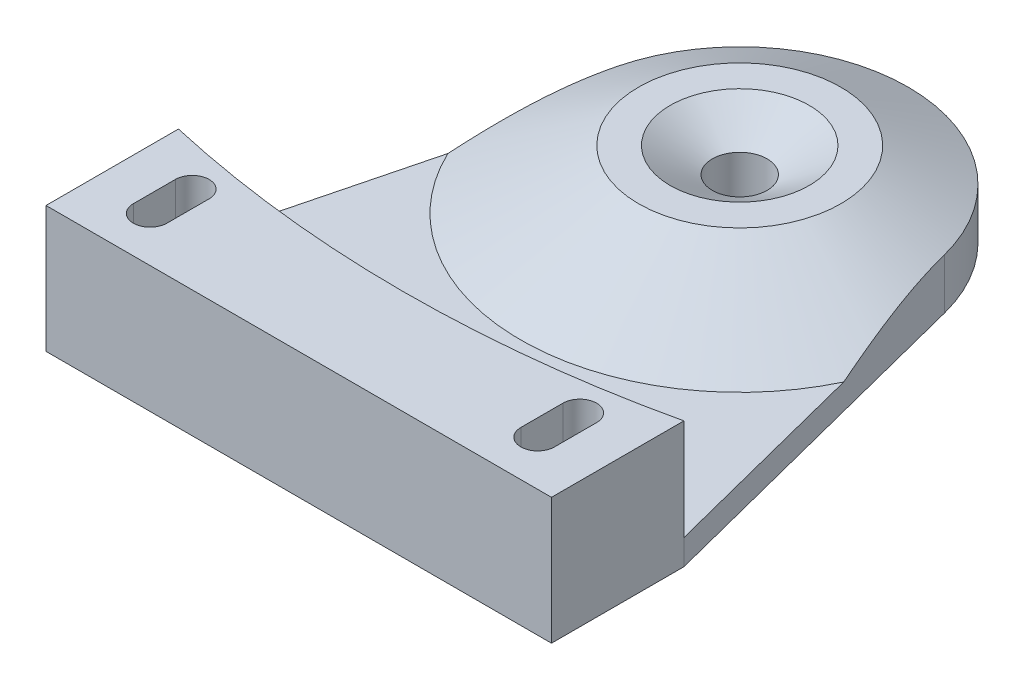
ISO-10303-21;
HEADER;
FILE_DESCRIPTION(('STEP AP214'),'2;1');
FILE_NAME('part.step','',(''),(''),'','','');
FILE_SCHEMA(('AUTOMOTIVE_DESIGN { 1 0 10303 214 1 1 1 1 }'));
ENDSEC;
DATA;
#1=APPLICATION_CONTEXT('core data for automotive mechanical design processes');
#2=APPLICATION_PROTOCOL_DEFINITION('international standard','automotive_design',2000,#1);
#3=PRODUCT_CONTEXT('',#1,'mechanical');
#4=PRODUCT('Part','Part','',(#3));
#5=PRODUCT_RELATED_PRODUCT_CATEGORY('part','',(#4));
#6=PRODUCT_DEFINITION_FORMATION('','',#4);
#7=PRODUCT_DEFINITION_CONTEXT('part definition',#1,'design');
#8=PRODUCT_DEFINITION('design','',#6,#7);
#9=PRODUCT_DEFINITION_SHAPE('','',#8);
#10=(LENGTH_UNIT() NAMED_UNIT(*) SI_UNIT(.MILLI.,.METRE.));
#11=(NAMED_UNIT(*) PLANE_ANGLE_UNIT() SI_UNIT($,.RADIAN.));
#12=(NAMED_UNIT(*) SI_UNIT($,.STERADIAN.) SOLID_ANGLE_UNIT());
#13=UNCERTAINTY_MEASURE_WITH_UNIT(LENGTH_MEASURE(1.E-05),#10,'distance_accuracy_value','');
#14=(GEOMETRIC_REPRESENTATION_CONTEXT(3) GLOBAL_UNCERTAINTY_ASSIGNED_CONTEXT((#13)) GLOBAL_UNIT_ASSIGNED_CONTEXT((#10,
#11,#12)) REPRESENTATION_CONTEXT('',''));
#15=CARTESIAN_POINT('',(0.,0.,0.));
#16=DIRECTION('',(0.,0.,1.));
#17=DIRECTION('',(1.,0.,0.));
#18=AXIS2_PLACEMENT_3D('',#15,#16,#17);
#19=CARTESIAN_POINT('',(30.,10.,372.350901436273));
#20=DIRECTION('',(-0.968875886471103,0.,0.247546998799894));
#21=DIRECTION('',(0.247546998799894,0.,0.968875886471103));
#22=AXIS2_PLACEMENT_3D('',#19,#20,#21);
#23=PLANE('',#22);
#24=DIRECTION('',(0.,-1.,0.));
#25=VECTOR('',#24,1.);
#26=CARTESIAN_POINT('',(19.3775177294221,10.,330.775495649393));
#27=LINE('',#26,#25);
#28=CARTESIAN_POINT('',(19.3775177294221,6.00000000000001,330.775495649393));
#29=VERTEX_POINT('',#28);
#30=CARTESIAN_POINT('',(19.3775177294221,0.,330.775495649393));
#31=VERTEX_POINT('',#30);
#32=EDGE_CURVE('E52',#29,#31,#27,.T.);
#33=ORIENTED_EDGE('',*,*,#32,.F.);
#34=CARTESIAN_POINT('',(19.3775177294221,6.00000000000001,330.775495649393));
#35=CARTESIAN_POINT('',(19.4653576637055,6.00001837678319,331.119292967111));
#36=CARTESIAN_POINT('',(19.5531965877423,5.99527873658229,331.463086330817));
#37=CARTESIAN_POINT('',(19.7288088840434,5.97641846988816,332.1504164947));
#38=CARTESIAN_POINT('',(19.8165822590787,5.96229826541334,332.493953305723));
#39=CARTESIAN_POINT('',(19.9919594290488,5.92482224007808,333.180363207056));
#40=CARTESIAN_POINT('',(20.0795632908415,5.90147152088045,333.523236559043));
#41=CARTESIAN_POINT('',(20.2545947180135,5.84579604390783,334.208293255281));
#42=CARTESIAN_POINT('',(20.3420222818002,5.81347120542544,334.5504765933));
#43=CARTESIAN_POINT('',(20.6029228107527,5.70395231440813,335.571616952485));
#44=CARTESIAN_POINT('',(20.7760749274221,5.6139793813379,336.249318202533));
#45=CARTESIAN_POINT('',(21.1212210492543,5.40312717585829,337.600187962107));
#46=CARTESIAN_POINT('',(21.2932149179657,5.28224432518143,338.273355937576));
#47=CARTESIAN_POINT('',(21.6354415536571,5.01374288579408,339.612799100438));
#48=CARTESIAN_POINT('',(21.8056777536492,4.86619516051103,340.279087724321));
#49=CARTESIAN_POINT('',(22.1448183664011,4.54793154069247,341.606452480958));
#50=CARTESIAN_POINT('',(22.3137226896494,4.37721410279847,342.267528263373));
#51=CARTESIAN_POINT('',(22.6512796681293,4.01501192800049,343.588694823035));
#52=CARTESIAN_POINT('',(22.819924228761,3.82340466618228,344.248753918774));
#53=CARTESIAN_POINT('',(23.0719388315378,3.52347904450955,345.235115590912));
#54=CARTESIAN_POINT('',(23.1557713234223,3.42143580825921,345.5632281525));
#55=CARTESIAN_POINT('',(23.3231410579882,3.213511984126,346.218297697807));
#56=CARTESIAN_POINT('',(23.4066783111607,3.10763153413315,346.545254722587));
#57=CARTESIAN_POINT('',(23.490077344272,3.00000000000001,346.871670766927));
#58=B_SPLINE_CURVE_WITH_KNOTS('',3,(#34,#35,#36,#37,#38,#39,#40,#41,#42,#43,#44,#45,#46,#47,#48,
#49,#50,#51,#52,#53,#54,#55,#56,#57),.UNSPECIFIED.,.F.,.F.,(4,2,2,2,2,2,2,2,2,2,2,4),(0.,
1.06448581509192,2.12892374370533,3.19277418311373,4.25663419041057,6.37148743220264,
8.4865856095986,10.5961433112673,12.7058416017824,14.8286573611,15.8897172994038,
16.9507391463226),.UNSPECIFIED.);
#59=CARTESIAN_POINT('',(23.490077344272,3.,346.871670766927));
#60=VERTEX_POINT('',#59);
#61=EDGE_CURVE('E297',#29,#60,#58,.T.);
#62=ORIENTED_EDGE('',*,*,#61,.T.);
#63=DIRECTION('',(0.247546998799894,0.,0.968875886471103));
#64=VECTOR('',#63,1.);
#65=CARTESIAN_POINT('',(30.,3.,372.350901436273));
#66=LINE('',#65,#64);
#67=CARTESIAN_POINT('',(30.,3.,372.350901436273));
#68=VERTEX_POINT('',#67);
#69=EDGE_CURVE('E173',#60,#68,#66,.T.);
#70=ORIENTED_EDGE('',*,*,#69,.T.);
#71=DIRECTION('',(0.,-1.,0.));
#72=VECTOR('',#71,1.);
#73=CARTESIAN_POINT('',(30.,10.,372.350901436273));
#74=LINE('',#73,#72);
#75=CARTESIAN_POINT('',(30.,0.,372.350901436273));
#76=VERTEX_POINT('',#75);
#77=EDGE_CURVE('E193',#68,#76,#74,.T.);
#78=ORIENTED_EDGE('',*,*,#77,.T.);
#79=DIRECTION('',(-0.247546998799894,0.,-0.968875886471103));
#80=VECTOR('',#79,1.);
#81=CARTESIAN_POINT('',(30.,0.,372.350901436273));
#82=LINE('',#81,#80);
#83=EDGE_CURVE('E514',#76,#31,#82,.T.);
#84=ORIENTED_EDGE('',*,*,#83,.T.);
#85=EDGE_LOOP('',(#33,#62,#70,#78,#84));
#86=FACE_BOUND('',#85,.T.);
#87=ADVANCED_FACE('F37',(#86),#23,.F.);
#88=CARTESIAN_POINT('',(0.,10.,335.726435625391));
#89=DIRECTION('',(0.,-1.,0.));
#90=DIRECTION('',(0.,0.,-1.));
#91=AXIS2_PLACEMENT_3D('',#88,#89,#90);
#92=CYLINDRICAL_SURFACE('',#91,20.);
#93=DIRECTION('',(0.,-1.,0.));
#94=VECTOR('',#93,1.);
#95=CARTESIAN_POINT('',(-19.3775177294221,10.,330.775495649393));
#96=LINE('',#95,#94);
#97=CARTESIAN_POINT('',(-19.3775177294221,6.00000000000001,330.775495649393));
#98=VERTEX_POINT('',#97);
#99=CARTESIAN_POINT('',(-19.3775177294221,0.,330.775495649393));
#100=VERTEX_POINT('',#99);
#101=EDGE_CURVE('E59',#98,#100,#96,.T.);
#102=ORIENTED_EDGE('',*,*,#101,.F.);
#103=CARTESIAN_POINT('',(0.,6.00000000000001,335.726435625391));
#104=DIRECTION('',(0.,-1.,0.));
#105=DIRECTION('',(0.,0.,-1.));
#106=AXIS2_PLACEMENT_3D('',#103,#104,#105);
#107=CIRCLE('',#106,20.);
#108=EDGE_CURVE('E284',#98,#29,#107,.T.);
#109=ORIENTED_EDGE('',*,*,#108,.T.);
#110=ORIENTED_EDGE('',*,*,#32,.T.);
#111=CARTESIAN_POINT('',(0.,0.,335.726435625391));
#112=DIRECTION('',(0.,1.,0.));
#113=DIRECTION('',(0.,0.,1.));
#114=AXIS2_PLACEMENT_3D('',#111,#112,#113);
#115=CIRCLE('',#114,20.);
#116=EDGE_CURVE('E188',#31,#100,#115,.T.);
#117=ORIENTED_EDGE('',*,*,#116,.T.);
#118=EDGE_LOOP('',(#102,#109,#110,#117));
#119=FACE_BOUND('',#118,.T.);
#120=ADVANCED_FACE('F307',(#119),#92,.T.);
#121=CARTESIAN_POINT('',(-30.,10.,372.350901436273));
#122=DIRECTION('',(0.968875886471103,0.,0.247546998799892));
#123=DIRECTION('',(0.247546998799892,0.,-0.968875886471103));
#124=AXIS2_PLACEMENT_3D('',#121,#122,#123);
#125=PLANE('',#124);
#126=DIRECTION('',(0.247546998799892,0.,-0.968875886471103));
#127=VECTOR('',#126,1.);
#128=CARTESIAN_POINT('',(-30.,3.,372.350901436273));
#129=LINE('',#128,#127);
#130=CARTESIAN_POINT('',(-30.,3.,372.350901436273));
#131=VERTEX_POINT('',#130);
#132=CARTESIAN_POINT('',(-23.4900773442719,3.,346.871670766927));
#133=VERTEX_POINT('',#132);
#134=EDGE_CURVE('E174',#131,#133,#129,.T.);
#135=ORIENTED_EDGE('',*,*,#134,.T.);
#136=CARTESIAN_POINT('',(-23.4900773442719,3.,346.871670766927));
#137=CARTESIAN_POINT('',(-23.4066783111607,3.10763153413313,346.545254722587));
#138=CARTESIAN_POINT('',(-23.3231410579882,3.21351198412598,346.218297697807));
#139=CARTESIAN_POINT('',(-23.1557713234223,3.42143580825919,345.5632281525));
#140=CARTESIAN_POINT('',(-23.0719388315378,3.52347904450953,345.235115590912));
#141=CARTESIAN_POINT('',(-22.819924228761,3.82340466618226,344.248753918774));
#142=CARTESIAN_POINT('',(-22.6512796681293,4.01501192800047,343.588694823036));
#143=CARTESIAN_POINT('',(-22.3137226896494,4.37721410279845,342.267528263373));
#144=CARTESIAN_POINT('',(-22.1448183664011,4.54793154069245,341.606452480958));
#145=CARTESIAN_POINT('',(-21.8056777536492,4.86619516051102,340.279087724321));
#146=CARTESIAN_POINT('',(-21.6354415536571,5.01374288579407,339.612799100438));
#147=CARTESIAN_POINT('',(-21.2932149179657,5.28224432518143,338.273355937576));
#148=CARTESIAN_POINT('',(-21.1212210492543,5.40312717585828,337.600187962107));
#149=CARTESIAN_POINT('',(-20.7760749274221,5.6139793813379,336.249318202533));
#150=CARTESIAN_POINT('',(-20.6029228107527,5.70395231440813,335.571616952485));
#151=CARTESIAN_POINT('',(-20.3420222818002,5.81347120542544,334.5504765933));
#152=CARTESIAN_POINT('',(-20.2545947180135,5.84579604390783,334.208293255281));
#153=CARTESIAN_POINT('',(-20.0795632908415,5.90147152088045,333.523236559043));
#154=CARTESIAN_POINT('',(-19.9919594290488,5.92482224007808,333.180363207056));
#155=CARTESIAN_POINT('',(-19.8165822590787,5.96229826541334,332.493953305723));
#156=CARTESIAN_POINT('',(-19.7288088840434,5.97641846988816,332.1504164947));
#157=CARTESIAN_POINT('',(-19.5531965877423,5.99527873658229,331.463086330817));
#158=CARTESIAN_POINT('',(-19.4653576637055,6.00001837678319,331.119292967111));
#159=CARTESIAN_POINT('',(-19.3775177294221,6.00000000000001,330.775495649393));
#160=B_SPLINE_CURVE_WITH_KNOTS('',3,(#136,#137,#138,#139,#140,#141,#142,#143,#144,#145,#146,
#147,#148,#149,#150,#151,#152,#153,#154,#155,#156,#157,#158,#159),.UNSPECIFIED.,.F.,.F.,(4,2,2,
2,2,2,2,2,2,2,2,4),(0.,1.06102184691878,2.12208178522253,4.24489754454015,6.35459583505528,
8.46415353672401,10.57925171412,12.694104955912,13.7579649632089,14.8218154026173,
15.8862533312307,16.9507391463227),.UNSPECIFIED.);
#161=EDGE_CURVE('E278',#133,#98,#160,.T.);
#162=ORIENTED_EDGE('',*,*,#161,.T.);
#163=ORIENTED_EDGE('',*,*,#101,.T.);
#164=DIRECTION('',(-0.247546998799892,0.,0.968875886471103));
#165=VECTOR('',#164,1.);
#166=CARTESIAN_POINT('',(-30.,0.,372.350901436273));
#167=LINE('',#166,#165);
#168=CARTESIAN_POINT('',(-30.,0.,372.350901436273));
#169=VERTEX_POINT('',#168);
#170=EDGE_CURVE('E185',#100,#169,#167,.T.);
#171=ORIENTED_EDGE('',*,*,#170,.T.);
#172=DIRECTION('',(0.,-1.,0.));
#173=VECTOR('',#172,1.);
#174=CARTESIAN_POINT('',(-30.,10.,372.350901436273));
#175=LINE('',#174,#173);
#176=EDGE_CURVE('E153',#131,#169,#175,.T.);
#177=ORIENTED_EDGE('',*,*,#176,.F.);
#178=EDGE_LOOP('',(#135,#162,#163,#171,#177));
#179=FACE_BOUND('',#178,.T.);
#180=ADVANCED_FACE('F183',(#179),#125,.F.);
#181=CARTESIAN_POINT('',(0.,15.,240.726435625391));
#182=DIRECTION('',(0.,1.,0.));
#183=DIRECTION('',(0.,0.,1.));
#184=AXIS2_PLACEMENT_3D('',#181,#182,#183);
#185=PLANE('',#184);
#186=DIRECTION('',(0.,0.,-1.));
#187=VECTOR('',#186,1.);
#188=CARTESIAN_POINT('',(-21.,15.,382.710658493947));
#189=LINE('',#188,#187);
#190=CARTESIAN_POINT('',(-21.,15.,382.710658493947));
#191=VERTEX_POINT('',#190);
#192=CARTESIAN_POINT('',(-21.,15.,377.710658493947));
#193=VERTEX_POINT('',#192);
#194=EDGE_CURVE('E229',#191,#193,#189,.T.);
#195=ORIENTED_EDGE('',*,*,#194,.F.);
#196=CARTESIAN_POINT('',(-23.,15.,382.710658493947));
#197=DIRECTION('',(0.,1.,0.));
#198=DIRECTION('',(0.,0.,1.));
#199=AXIS2_PLACEMENT_3D('',#196,#197,#198);
#200=CIRCLE('',#199,2.);
#201=CARTESIAN_POINT('',(-25.,15.,382.710658493947));
#202=VERTEX_POINT('',#201);
#203=EDGE_CURVE('E227',#202,#191,#200,.T.);
#204=ORIENTED_EDGE('',*,*,#203,.F.);
#205=DIRECTION('',(0.,0.,1.));
#206=VECTOR('',#205,1.);
#207=CARTESIAN_POINT('',(-25.,15.,377.710658493947));
#208=LINE('',#207,#206);
#209=CARTESIAN_POINT('',(-25.,15.,377.710658493947));
#210=VERTEX_POINT('',#209);
#211=EDGE_CURVE('E235',#210,#202,#208,.T.);
#212=ORIENTED_EDGE('',*,*,#211,.F.);
#213=CARTESIAN_POINT('',(-23.,15.,377.710658493947));
#214=DIRECTION('',(0.,1.,0.));
#215=DIRECTION('',(0.,0.,1.));
#216=AXIS2_PLACEMENT_3D('',#213,#214,#215);
#217=CIRCLE('',#216,2.);
#218=EDGE_CURVE('E232',#193,#210,#217,.T.);
#219=ORIENTED_EDGE('',*,*,#218,.F.);
#220=EDGE_LOOP('',(#195,#204,#212,#219));
#221=FACE_BOUND('',#220,.T.);
#222=CARTESIAN_POINT('',(0.,15.,240.726435625391));
#223=DIRECTION('',(0.,-1.,0.));
#224=DIRECTION('',(0.,0.,1.));
#225=AXIS2_PLACEMENT_3D('',#222,#223,#224);
#226=CIRCLE('',#225,135.);
#227=CARTESIAN_POINT('',(30.,15.,372.350901436273));
#228=VERTEX_POINT('',#227);
#229=CARTESIAN_POINT('',(-30.,15.,372.350901436273));
#230=VERTEX_POINT('',#229);
#231=EDGE_CURVE('E258',#228,#230,#226,.T.);
#232=ORIENTED_EDGE('',*,*,#231,.T.);
#233=DIRECTION('',(0.,0.,1.));
#234=VECTOR('',#233,1.);
#235=CARTESIAN_POINT('',(-30.,15.,372.350901436273));
#236=LINE('',#235,#234);
#237=CARTESIAN_POINT('',(-30.,15.,388.07041555162));
#238=VERTEX_POINT('',#237);
#239=EDGE_CURVE('E156',#230,#238,#236,.T.);
#240=ORIENTED_EDGE('',*,*,#239,.T.);
#241=DIRECTION('',(1.,0.,0.));
#242=VECTOR('',#241,1.);
#243=CARTESIAN_POINT('',(-30.,15.,388.07041555162));
#244=LINE('',#243,#242);
#245=CARTESIAN_POINT('',(30.,15.,388.07041555162));
#246=VERTEX_POINT('',#245);
#247=EDGE_CURVE('E262',#238,#246,#244,.T.);
#248=ORIENTED_EDGE('',*,*,#247,.T.);
#249=DIRECTION('',(0.,0.,-1.));
#250=VECTOR('',#249,1.);
#251=CARTESIAN_POINT('',(30.,15.,372.350901436273));
#252=LINE('',#251,#250);
#253=EDGE_CURVE('E264',#246,#228,#252,.T.);
#254=ORIENTED_EDGE('',*,*,#253,.T.);
#255=EDGE_LOOP('',(#232,#240,#248,#254));
#256=FACE_BOUND('',#255,.T.);
#257=DIRECTION('',(0.,0.,-1.));
#258=VECTOR('',#257,1.);
#259=CARTESIAN_POINT('',(25.,15.,377.710658493947));
#260=LINE('',#259,#258);
#261=CARTESIAN_POINT('',(25.,15.,382.710658493947));
#262=VERTEX_POINT('',#261);
#263=CARTESIAN_POINT('',(25.,15.,377.710658493947));
#264=VERTEX_POINT('',#263);
#265=EDGE_CURVE('E198',#262,#264,#260,.T.);
#266=ORIENTED_EDGE('',*,*,#265,.F.);
#267=CARTESIAN_POINT('',(23.,15.,382.710658493947));
#268=DIRECTION('',(0.,1.,0.));
#269=DIRECTION('',(0.,0.,-1.));
#270=AXIS2_PLACEMENT_3D('',#267,#268,#269);
#271=CIRCLE('',#270,2.);
#272=CARTESIAN_POINT('',(21.,15.,382.710658493947));
#273=VERTEX_POINT('',#272);
#274=EDGE_CURVE('E196',#273,#262,#271,.T.);
#275=ORIENTED_EDGE('',*,*,#274,.F.);
#276=DIRECTION('',(0.,0.,1.));
#277=VECTOR('',#276,1.);
#278=CARTESIAN_POINT('',(21.,15.,382.710658493947));
#279=LINE('',#278,#277);
#280=CARTESIAN_POINT('',(21.,15.,377.710658493947));
#281=VERTEX_POINT('',#280);
#282=EDGE_CURVE('E204',#281,#273,#279,.T.);
#283=ORIENTED_EDGE('',*,*,#282,.F.);
#284=CARTESIAN_POINT('',(23.,15.,377.710658493947));
#285=DIRECTION('',(0.,1.,0.));
#286=DIRECTION('',(0.,0.,-1.));
#287=AXIS2_PLACEMENT_3D('',#284,#285,#286);
#288=CIRCLE('',#287,2.);
#289=EDGE_CURVE('E201',#264,#281,#288,.T.);
#290=ORIENTED_EDGE('',*,*,#289,.F.);
#291=EDGE_LOOP('',(#266,#275,#283,#290));
#292=FACE_BOUND('',#291,.T.);
#293=ADVANCED_FACE('F341',(#221,#256,#292),#185,.T.);
#294=CARTESIAN_POINT('',(0.,0.,240.726435625391));
#295=DIRECTION('',(0.,1.,0.));
#296=DIRECTION('',(0.,0.,1.));
#297=AXIS2_PLACEMENT_3D('',#294,#295,#296);
#298=PLANE('',#297);
#299=CARTESIAN_POINT('',(-23.,0.,382.710658493947));
#300=DIRECTION('',(0.,1.,0.));
#301=DIRECTION('',(0.,0.,1.));
#302=AXIS2_PLACEMENT_3D('',#299,#300,#301);
#303=CIRCLE('',#302,2.);
#304=CARTESIAN_POINT('',(-25.,0.,382.710658493946));
#305=VERTEX_POINT('',#304);
#306=CARTESIAN_POINT('',(-21.,0.,382.710658493947));
#307=VERTEX_POINT('',#306);
#308=EDGE_CURVE('E226',#305,#307,#303,.T.);
#309=ORIENTED_EDGE('',*,*,#308,.T.);
#310=DIRECTION('',(0.,0.,-1.));
#311=VECTOR('',#310,1.);
#312=CARTESIAN_POINT('',(-21.,0.,382.710658493947));
#313=LINE('',#312,#311);
#314=CARTESIAN_POINT('',(-21.,0.,377.710658493947));
#315=VERTEX_POINT('',#314);
#316=EDGE_CURVE('E240',#307,#315,#313,.T.);
#317=ORIENTED_EDGE('',*,*,#316,.T.);
#318=CARTESIAN_POINT('',(-23.,0.,377.710658493947));
#319=DIRECTION('',(0.,1.,0.));
#320=DIRECTION('',(0.,0.,1.));
#321=AXIS2_PLACEMENT_3D('',#318,#319,#320);
#322=CIRCLE('',#321,2.);
#323=CARTESIAN_POINT('',(-25.,0.,377.710658493947));
#324=VERTEX_POINT('',#323);
#325=EDGE_CURVE('E243',#315,#324,#322,.T.);
#326=ORIENTED_EDGE('',*,*,#325,.T.);
#327=DIRECTION('',(0.,0.,1.));
#328=VECTOR('',#327,1.);
#329=CARTESIAN_POINT('',(-25.,0.,377.710658493947));
#330=LINE('',#329,#328);
#331=EDGE_CURVE('E230',#324,#305,#330,.T.);
#332=ORIENTED_EDGE('',*,*,#331,.T.);
#333=EDGE_LOOP('',(#309,#317,#326,#332));
#334=FACE_BOUND('',#333,.T.);
#335=DIRECTION('',(0.,0.,1.));
#336=VECTOR('',#335,1.);
#337=CARTESIAN_POINT('',(-30.,0.,372.350901436273));
#338=LINE('',#337,#336);
#339=CARTESIAN_POINT('',(-30.,0.,388.07041555162));
#340=VERTEX_POINT('',#339);
#341=EDGE_CURVE('E257',#169,#340,#338,.T.);
#342=ORIENTED_EDGE('',*,*,#341,.F.);
#343=ORIENTED_EDGE('',*,*,#170,.F.);
#344=ORIENTED_EDGE('',*,*,#116,.F.);
#345=ORIENTED_EDGE('',*,*,#83,.F.);
#346=DIRECTION('',(0.,0.,-1.));
#347=VECTOR('',#346,1.);
#348=CARTESIAN_POINT('',(30.,0.,372.350901436273));
#349=LINE('',#348,#347);
#350=CARTESIAN_POINT('',(30.,0.,388.07041555162));
#351=VERTEX_POINT('',#350);
#352=EDGE_CURVE('E260',#351,#76,#349,.T.);
#353=ORIENTED_EDGE('',*,*,#352,.F.);
#354=DIRECTION('',(1.,0.,0.));
#355=VECTOR('',#354,1.);
#356=CARTESIAN_POINT('',(-30.,0.,388.07041555162));
#357=LINE('',#356,#355);
#358=EDGE_CURVE('E267',#340,#351,#357,.T.);
#359=ORIENTED_EDGE('',*,*,#358,.F.);
#360=EDGE_LOOP('',(#342,#343,#344,#345,#353,#359));
#361=FACE_BOUND('',#360,.T.);
#362=CARTESIAN_POINT('',(23.,0.,382.710658493947));
#363=DIRECTION('',(0.,1.,0.));
#364=DIRECTION('',(0.,0.,-1.));
#365=AXIS2_PLACEMENT_3D('',#362,#363,#364);
#366=CIRCLE('',#365,2.);
#367=CARTESIAN_POINT('',(21.,0.,382.710658493946));
#368=VERTEX_POINT('',#367);
#369=CARTESIAN_POINT('',(25.,0.,382.710658493947));
#370=VERTEX_POINT('',#369);
#371=EDGE_CURVE('E195',#368,#370,#366,.T.);
#372=ORIENTED_EDGE('',*,*,#371,.T.);
#373=DIRECTION('',(0.,0.,-1.));
#374=VECTOR('',#373,1.);
#375=CARTESIAN_POINT('',(25.,0.,377.710658493947));
#376=LINE('',#375,#374);
#377=CARTESIAN_POINT('',(25.,0.,377.710658493947));
#378=VERTEX_POINT('',#377);
#379=EDGE_CURVE('E209',#370,#378,#376,.T.);
#380=ORIENTED_EDGE('',*,*,#379,.T.);
#381=CARTESIAN_POINT('',(23.,0.,377.710658493947));
#382=DIRECTION('',(0.,1.,0.));
#383=DIRECTION('',(0.,0.,-1.));
#384=AXIS2_PLACEMENT_3D('',#381,#382,#383);
#385=CIRCLE('',#384,2.);
#386=CARTESIAN_POINT('',(21.,0.,377.710658493947));
#387=VERTEX_POINT('',#386);
#388=EDGE_CURVE('E212',#378,#387,#385,.T.);
#389=ORIENTED_EDGE('',*,*,#388,.T.);
#390=DIRECTION('',(0.,0.,1.));
#391=VECTOR('',#390,1.);
#392=CARTESIAN_POINT('',(21.,0.,382.710658493947));
#393=LINE('',#392,#391);
#394=EDGE_CURVE('E199',#387,#368,#393,.T.);
#395=ORIENTED_EDGE('',*,*,#394,.T.);
#396=EDGE_LOOP('',(#372,#380,#389,#395));
#397=FACE_BOUND('',#396,.T.);
#398=ADVANCED_FACE('F344',(#334,#361,#397),#298,.F.);
#399=CARTESIAN_POINT('',(0.,15.,240.726435625391));
#400=DIRECTION('',(0.,-1.,0.));
#401=DIRECTION('',(0.,0.,-1.));
#402=AXIS2_PLACEMENT_3D('',#399,#400,#401);
#403=CYLINDRICAL_SURFACE('',#402,135.);
#404=DIRECTION('',(0.,-1.,0.));
#405=VECTOR('',#404,1.);
#406=CARTESIAN_POINT('',(30.,15.,372.350901436273));
#407=LINE('',#406,#405);
#408=EDGE_CURVE('E169',#228,#68,#407,.T.);
#409=ORIENTED_EDGE('',*,*,#408,.T.);
#410=CARTESIAN_POINT('',(0.,3.,240.726435625391));
#411=DIRECTION('',(0.,1.,0.));
#412=DIRECTION('',(0.,0.,1.));
#413=AXIS2_PLACEMENT_3D('',#410,#411,#412);
#414=CIRCLE('',#413,135.);
#415=EDGE_CURVE('E165',#68,#131,#414,.F.);
#416=ORIENTED_EDGE('',*,*,#415,.T.);
#417=DIRECTION('',(0.,-1.,0.));
#418=VECTOR('',#417,1.);
#419=CARTESIAN_POINT('',(-30.,15.,372.350901436273));
#420=LINE('',#419,#418);
#421=EDGE_CURVE('E149',#230,#131,#420,.T.);
#422=ORIENTED_EDGE('',*,*,#421,.F.);
#423=ORIENTED_EDGE('',*,*,#231,.F.);
#424=EDGE_LOOP('',(#409,#416,#422,#423));
#425=FACE_BOUND('',#424,.T.);
#426=ADVANCED_FACE('F167',(#425),#403,.F.);
#427=CARTESIAN_POINT('',(-30.,15.,372.350901436273));
#428=DIRECTION('',(1.,0.,0.));
#429=DIRECTION('',(0.,0.,-1.));
#430=AXIS2_PLACEMENT_3D('',#427,#428,#429);
#431=PLANE('',#430);
#432=ORIENTED_EDGE('',*,*,#341,.T.);
#433=DIRECTION('',(0.,-1.,0.));
#434=VECTOR('',#433,1.);
#435=CARTESIAN_POINT('',(-30.,15.,388.07041555162));
#436=LINE('',#435,#434);
#437=EDGE_CURVE('E161',#238,#340,#436,.T.);
#438=ORIENTED_EDGE('',*,*,#437,.F.);
#439=ORIENTED_EDGE('',*,*,#239,.F.);
#440=ORIENTED_EDGE('',*,*,#421,.T.);
#441=ORIENTED_EDGE('',*,*,#176,.T.);
#442=EDGE_LOOP('',(#432,#438,#439,#440,#441));
#443=FACE_BOUND('',#442,.T.);
#444=ADVANCED_FACE('F151',(#443),#431,.F.);
#445=CARTESIAN_POINT('',(-30.,15.,388.07041555162));
#446=DIRECTION('',(0.,0.,-1.));
#447=DIRECTION('',(-1.,0.,0.));
#448=AXIS2_PLACEMENT_3D('',#445,#446,#447);
#449=PLANE('',#448);
#450=ORIENTED_EDGE('',*,*,#358,.T.);
#451=DIRECTION('',(0.,-1.,0.));
#452=VECTOR('',#451,1.);
#453=CARTESIAN_POINT('',(30.,15.,388.07041555162));
#454=LINE('',#453,#452);
#455=EDGE_CURVE('E272',#246,#351,#454,.T.);
#456=ORIENTED_EDGE('',*,*,#455,.F.);
#457=ORIENTED_EDGE('',*,*,#247,.F.);
#458=ORIENTED_EDGE('',*,*,#437,.T.);
#459=EDGE_LOOP('',(#450,#456,#457,#458));
#460=FACE_BOUND('',#459,.T.);
#461=ADVANCED_FACE('F351',(#460),#449,.F.);
#462=CARTESIAN_POINT('',(30.,15.,372.350901436273));
#463=DIRECTION('',(-1.,0.,0.));
#464=DIRECTION('',(0.,0.,1.));
#465=AXIS2_PLACEMENT_3D('',#462,#463,#464);
#466=PLANE('',#465);
#467=ORIENTED_EDGE('',*,*,#352,.T.);
#468=ORIENTED_EDGE('',*,*,#77,.F.);
#469=ORIENTED_EDGE('',*,*,#408,.F.);
#470=ORIENTED_EDGE('',*,*,#253,.F.);
#471=ORIENTED_EDGE('',*,*,#455,.T.);
#472=EDGE_LOOP('',(#467,#468,#469,#470,#471));
#473=FACE_BOUND('',#472,.T.);
#474=ADVANCED_FACE('F339',(#473),#466,.F.);
#475=CARTESIAN_POINT('',(-23.,15.,382.710658493947));
#476=DIRECTION('',(0.,-1.,0.));
#477=DIRECTION('',(0.,0.,-1.));
#478=AXIS2_PLACEMENT_3D('',#475,#476,#477);
#479=CYLINDRICAL_SURFACE('',#478,2.);
#480=ORIENTED_EDGE('',*,*,#308,.F.);
#481=DIRECTION('',(0.,-1.,0.));
#482=VECTOR('',#481,1.);
#483=CARTESIAN_POINT('',(-25.,15.,382.710658493947));
#484=LINE('',#483,#482);
#485=EDGE_CURVE('E237',#202,#305,#484,.T.);
#486=ORIENTED_EDGE('',*,*,#485,.F.);
#487=ORIENTED_EDGE('',*,*,#203,.T.);
#488=DIRECTION('',(0.,-1.,0.));
#489=VECTOR('',#488,1.);
#490=CARTESIAN_POINT('',(-21.,15.,382.710658493947));
#491=LINE('',#490,#489);
#492=EDGE_CURVE('E254',#191,#307,#491,.T.);
#493=ORIENTED_EDGE('',*,*,#492,.T.);
#494=EDGE_LOOP('',(#480,#486,#487,#493));
#495=FACE_BOUND('',#494,.T.);
#496=ADVANCED_FACE('F335',(#495),#479,.F.);
#497=CARTESIAN_POINT('',(-21.,15.,382.710658493947));
#498=DIRECTION('',(-1.,0.,0.));
#499=DIRECTION('',(0.,0.,1.));
#500=AXIS2_PLACEMENT_3D('',#497,#498,#499);
#501=PLANE('',#500);
#502=ORIENTED_EDGE('',*,*,#316,.F.);
#503=ORIENTED_EDGE('',*,*,#492,.F.);
#504=ORIENTED_EDGE('',*,*,#194,.T.);
#505=DIRECTION('',(0.,-1.,0.));
#506=VECTOR('',#505,1.);
#507=CARTESIAN_POINT('',(-21.,15.,377.710658493947));
#508=LINE('',#507,#506);
#509=EDGE_CURVE('E252',#193,#315,#508,.T.);
#510=ORIENTED_EDGE('',*,*,#509,.T.);
#511=EDGE_LOOP('',(#502,#503,#504,#510));
#512=FACE_BOUND('',#511,.T.);
#513=ADVANCED_FACE('F331',(#512),#501,.T.);
#514=CARTESIAN_POINT('',(-23.,15.,377.710658493947));
#515=DIRECTION('',(0.,-1.,0.));
#516=DIRECTION('',(0.,0.,-1.));
#517=AXIS2_PLACEMENT_3D('',#514,#515,#516);
#518=CYLINDRICAL_SURFACE('',#517,2.);
#519=ORIENTED_EDGE('',*,*,#325,.F.);
#520=ORIENTED_EDGE('',*,*,#509,.F.);
#521=ORIENTED_EDGE('',*,*,#218,.T.);
#522=DIRECTION('',(0.,-1.,0.));
#523=VECTOR('',#522,1.);
#524=CARTESIAN_POINT('',(-25.,15.,377.710658493947));
#525=LINE('',#524,#523);
#526=EDGE_CURVE('E250',#210,#324,#525,.T.);
#527=ORIENTED_EDGE('',*,*,#526,.T.);
#528=EDGE_LOOP('',(#519,#520,#521,#527));
#529=FACE_BOUND('',#528,.T.);
#530=ADVANCED_FACE('F327',(#529),#518,.F.);
#531=CARTESIAN_POINT('',(-25.,15.,377.710658493947));
#532=DIRECTION('',(1.,0.,0.));
#533=DIRECTION('',(0.,0.,-1.));
#534=AXIS2_PLACEMENT_3D('',#531,#532,#533);
#535=PLANE('',#534);
#536=ORIENTED_EDGE('',*,*,#331,.F.);
#537=ORIENTED_EDGE('',*,*,#526,.F.);
#538=ORIENTED_EDGE('',*,*,#211,.T.);
#539=ORIENTED_EDGE('',*,*,#485,.T.);
#540=EDGE_LOOP('',(#536,#537,#538,#539));
#541=FACE_BOUND('',#540,.T.);
#542=ADVANCED_FACE('F323',(#541),#535,.T.);
#543=CARTESIAN_POINT('',(23.,15.,382.710658493947));
#544=DIRECTION('',(0.,-1.,0.));
#545=DIRECTION('',(0.,0.,-1.));
#546=AXIS2_PLACEMENT_3D('',#543,#544,#545);
#547=CYLINDRICAL_SURFACE('',#546,2.);
#548=ORIENTED_EDGE('',*,*,#371,.F.);
#549=DIRECTION('',(0.,-1.,0.));
#550=VECTOR('',#549,1.);
#551=CARTESIAN_POINT('',(21.,15.,382.710658493947));
#552=LINE('',#551,#550);
#553=EDGE_CURVE('E206',#273,#368,#552,.T.);
#554=ORIENTED_EDGE('',*,*,#553,.F.);
#555=ORIENTED_EDGE('',*,*,#274,.T.);
#556=DIRECTION('',(0.,-1.,0.));
#557=VECTOR('',#556,1.);
#558=CARTESIAN_POINT('',(25.,15.,382.710658493947));
#559=LINE('',#558,#557);
#560=EDGE_CURVE('E223',#262,#370,#559,.T.);
#561=ORIENTED_EDGE('',*,*,#560,.T.);
#562=EDGE_LOOP('',(#548,#554,#555,#561));
#563=FACE_BOUND('',#562,.T.);
#564=ADVANCED_FACE('F319',(#563),#547,.F.);
#565=CARTESIAN_POINT('',(25.,15.,377.710658493947));
#566=DIRECTION('',(-1.,0.,0.));
#567=DIRECTION('',(0.,0.,1.));
#568=AXIS2_PLACEMENT_3D('',#565,#566,#567);
#569=PLANE('',#568);
#570=ORIENTED_EDGE('',*,*,#379,.F.);
#571=ORIENTED_EDGE('',*,*,#560,.F.);
#572=ORIENTED_EDGE('',*,*,#265,.T.);
#573=DIRECTION('',(0.,-1.,0.));
#574=VECTOR('',#573,1.);
#575=CARTESIAN_POINT('',(25.,15.,377.710658493947));
#576=LINE('',#575,#574);
#577=EDGE_CURVE('E221',#264,#378,#576,.T.);
#578=ORIENTED_EDGE('',*,*,#577,.T.);
#579=EDGE_LOOP('',(#570,#571,#572,#578));
#580=FACE_BOUND('',#579,.T.);
#581=ADVANCED_FACE('F315',(#580),#569,.T.);
#582=CARTESIAN_POINT('',(23.,15.,377.710658493947));
#583=DIRECTION('',(0.,-1.,0.));
#584=DIRECTION('',(0.,0.,-1.));
#585=AXIS2_PLACEMENT_3D('',#582,#583,#584);
#586=CYLINDRICAL_SURFACE('',#585,2.);
#587=ORIENTED_EDGE('',*,*,#388,.F.);
#588=ORIENTED_EDGE('',*,*,#577,.F.);
#589=ORIENTED_EDGE('',*,*,#289,.T.);
#590=DIRECTION('',(0.,-1.,0.));
#591=VECTOR('',#590,1.);
#592=CARTESIAN_POINT('',(21.,15.,377.710658493947));
#593=LINE('',#592,#591);
#594=EDGE_CURVE('E219',#281,#387,#593,.T.);
#595=ORIENTED_EDGE('',*,*,#594,.T.);
#596=EDGE_LOOP('',(#587,#588,#589,#595));
#597=FACE_BOUND('',#596,.T.);
#598=ADVANCED_FACE('F311',(#597),#586,.F.);
#599=CARTESIAN_POINT('',(21.,15.,382.710658493947));
#600=DIRECTION('',(1.,0.,0.));
#601=DIRECTION('',(0.,0.,-1.));
#602=AXIS2_PLACEMENT_3D('',#599,#600,#601);
#603=PLANE('',#602);
#604=ORIENTED_EDGE('',*,*,#394,.F.);
#605=ORIENTED_EDGE('',*,*,#594,.F.);
#606=ORIENTED_EDGE('',*,*,#282,.T.);
#607=ORIENTED_EDGE('',*,*,#553,.T.);
#608=EDGE_LOOP('',(#604,#605,#606,#607));
#609=FACE_BOUND('',#608,.T.);
#610=ADVANCED_FACE('F308',(#609),#603,.T.);
#611=CARTESIAN_POINT('',(0.,3.,240.726435625391));
#612=DIRECTION('',(0.,1.,0.));
#613=DIRECTION('',(0.,0.,1.));
#614=AXIS2_PLACEMENT_3D('',#611,#612,#613);
#615=PLANE('',#614);
#616=ORIENTED_EDGE('',*,*,#69,.F.);
#617=CARTESIAN_POINT('',(0.,3.,335.726435625391));
#618=DIRECTION('',(0.,1.,0.));
#619=DIRECTION('',(0.,0.,1.));
#620=AXIS2_PLACEMENT_3D('',#617,#618,#619);
#621=CIRCLE('',#620,26.);
#622=EDGE_CURVE('E160',#60,#133,#621,.F.);
#623=ORIENTED_EDGE('',*,*,#622,.T.);
#624=ORIENTED_EDGE('',*,*,#134,.F.);
#625=ORIENTED_EDGE('',*,*,#415,.F.);
#626=EDGE_LOOP('',(#616,#623,#624,#625));
#627=FACE_BOUND('',#626,.T.);
#628=ADVANCED_FACE('F178',(#627),#615,.T.);
#629=CARTESIAN_POINT('',(0.,1.,240.726435625391));
#630=DIRECTION('',(0.,1.,0.));
#631=DIRECTION('',(0.,0.,1.));
#632=AXIS2_PLACEMENT_3D('',#629,#630,#631);
#633=PLANE('',#632);
#634=CARTESIAN_POINT('',(0.,0.999999999999999,335.726435625391));
#635=DIRECTION('',(0.,1.,0.));
#636=DIRECTION('',(0.,0.,1.));
#637=AXIS2_PLACEMENT_3D('',#634,#635,#636);
#638=CIRCLE('',#637,3.25);
#639=CARTESIAN_POINT('',(0.,0.999999999999999,338.976435625391));
#640=VERTEX_POINT('',#639);
#641=EDGE_CURVE('E523',#640,#640,#638,.F.);
#642=ORIENTED_EDGE('',*,*,#641,.F.);
#643=EDGE_LOOP('',(#642));
#644=FACE_BOUND('',#643,.T.);
#645=ADVANCED_FACE('F460',(#644),#633,.T.);
#646=CARTESIAN_POINT('',(0.,-9.19238815542509,335.726435625391));
#647=DIRECTION('',(0.,1.,0.));
#648=DIRECTION('',(0.,0.,1.));
#649=AXIS2_PLACEMENT_3D('',#646,#647,#648);
#650=CYLINDRICAL_SURFACE('',#649,3.25);
#651=CARTESIAN_POINT('',(0.,7.,335.726435625391));
#652=DIRECTION('',(0.,1.,0.));
#653=DIRECTION('',(0.,0.,1.));
#654=AXIS2_PLACEMENT_3D('',#651,#652,#653);
#655=CIRCLE('',#654,3.25);
#656=CARTESIAN_POINT('',(0.,7.,338.976435625391));
#657=VERTEX_POINT('',#656);
#658=EDGE_CURVE('E45',#657,#657,#655,.T.);
#659=ORIENTED_EDGE('',*,*,#658,.T.);
#660=EDGE_LOOP('',(#659));
#661=FACE_BOUND('',#660,.T.);
#662=ORIENTED_EDGE('',*,*,#641,.T.);
#663=EDGE_LOOP('',(#662));
#664=FACE_BOUND('',#663,.T.);
#665=ADVANCED_FACE('F467',(#661,#664),#650,.F.);
#666=CARTESIAN_POINT('',(0.,10.,240.726435625391));
#667=DIRECTION('',(0.,1.,0.));
#668=DIRECTION('',(0.,0.,1.));
#669=AXIS2_PLACEMENT_3D('',#666,#667,#668);
#670=PLANE('',#669);
#671=CARTESIAN_POINT('',(0.,10.,335.726435625391));
#672=DIRECTION('',(0.,1.,0.));
#673=DIRECTION('',(0.,0.,1.));
#674=AXIS2_PLACEMENT_3D('',#671,#672,#673);
#675=CIRCLE('',#674,8.25000000000004);
#676=CARTESIAN_POINT('',(0.,10.,343.976435625391));
#677=VERTEX_POINT('',#676);
#678=EDGE_CURVE('E12',#677,#677,#675,.F.);
#679=ORIENTED_EDGE('',*,*,#678,.T.);
#680=EDGE_LOOP('',(#679));
#681=FACE_BOUND('',#680,.T.);
#682=CARTESIAN_POINT('',(0.,10.,335.726435625391));
#683=DIRECTION('',(0.,1.,0.));
#684=DIRECTION('',(0.,0.,1.));
#685=AXIS2_PLACEMENT_3D('',#682,#683,#684);
#686=CIRCLE('',#685,12.);
#687=CARTESIAN_POINT('',(0.,10.,347.726435625391));
#688=VERTEX_POINT('',#687);
#689=EDGE_CURVE('E303',#688,#688,#686,.T.);
#690=ORIENTED_EDGE('',*,*,#689,.T.);
#691=EDGE_LOOP('',(#690));
#692=FACE_BOUND('',#691,.T.);
#693=ADVANCED_FACE('F293',(#681,#692),#670,.T.);
#694=CARTESIAN_POINT('',(0.,3.,335.726435625391));
#695=DIRECTION('',(0.,-1.,0.));
#696=DIRECTION('',(0.,0.,-1.));
#697=AXIS2_PLACEMENT_3D('',#694,#695,#696);
#698=CONICAL_SURFACE('',#697,26.,1.10714871779409);
#699=ORIENTED_EDGE('',*,*,#689,.F.);
#700=EDGE_LOOP('',(#699));
#701=FACE_BOUND('',#700,.T.);
#702=ORIENTED_EDGE('',*,*,#161,.F.);
#703=ORIENTED_EDGE('',*,*,#622,.F.);
#704=ORIENTED_EDGE('',*,*,#61,.F.);
#705=ORIENTED_EDGE('',*,*,#108,.F.);
#706=EDGE_LOOP('',(#702,#703,#704,#705));
#707=FACE_BOUND('',#706,.T.);
#708=ADVANCED_FACE('F289',(#701,#707),#698,.T.);
#709=CARTESIAN_POINT('',(0.,7.,335.726435625391));
#710=DIRECTION('',(0.,1.,0.));
#711=DIRECTION('',(0.,0.,1.));
#712=AXIS2_PLACEMENT_3D('',#709,#710,#711);
#713=CONICAL_SURFACE('',#712,3.25,1.03037682652431);
#714=ORIENTED_EDGE('',*,*,#678,.F.);
#715=EDGE_LOOP('',(#714));
#716=FACE_BOUND('',#715,.T.);
#717=ORIENTED_EDGE('',*,*,#658,.F.);
#718=EDGE_LOOP('',(#717));
#719=FACE_BOUND('',#718,.T.);
#720=ADVANCED_FACE('F39',(#716,#719),#713,.F.);
#721=CLOSED_SHELL('',(#87,#120,#180,#293,#398,#426,#444,#461,#474,#496,#513,#530,#542,#564,#581,
#598,#610,#628,#645,#665,#693,#708,#720));
#722=MANIFOLD_SOLID_BREP('B2',#721);
#723=ADVANCED_BREP_SHAPE_REPRESENTATION('',(#18,#722),#14);
#724=SHAPE_DEFINITION_REPRESENTATION(#9,#723);
ENDSEC;
END-ISO-10303-21;
